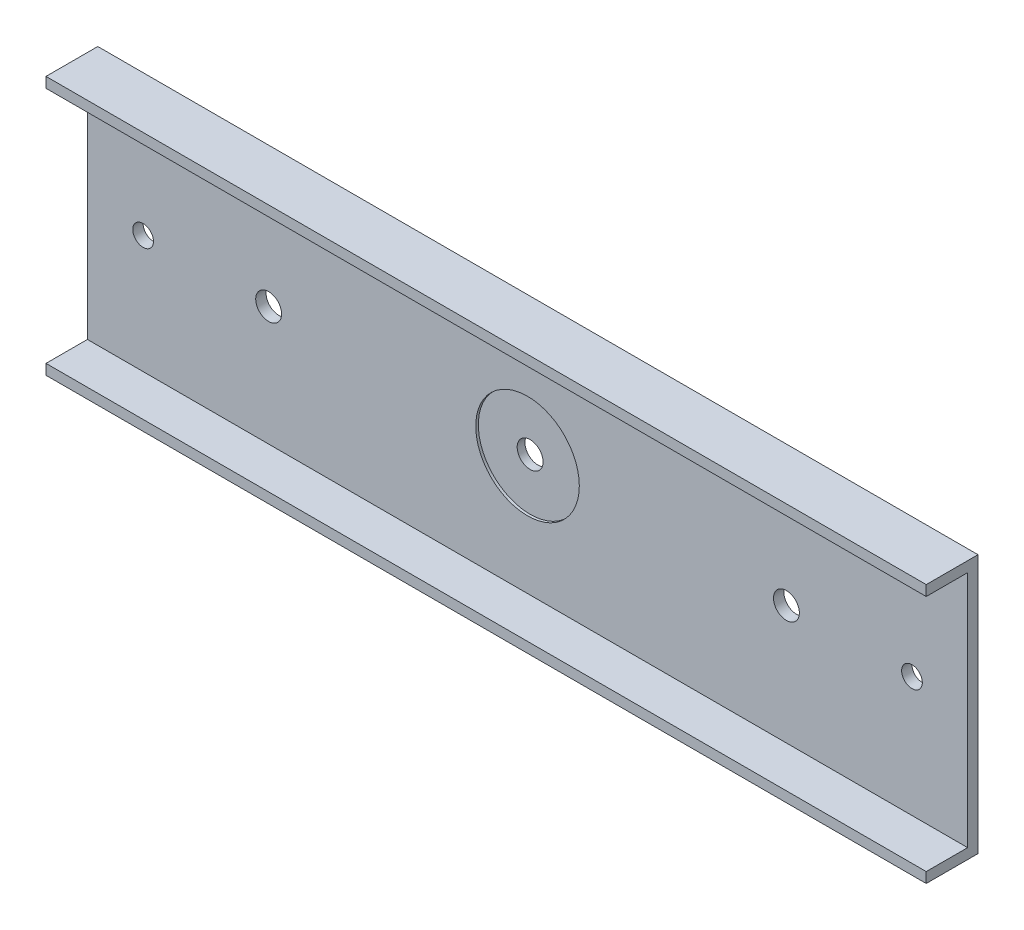
ISO-10303-21;
HEADER;
FILE_DESCRIPTION(('STEP AP214'),'2;1');
FILE_NAME('part.step','',(''),(''),'','','');
FILE_SCHEMA(('AUTOMOTIVE_DESIGN { 1 0 10303 214 1 1 1 1 }'));
ENDSEC;
DATA;
#1=APPLICATION_CONTEXT('core data for automotive mechanical design processes');
#2=APPLICATION_PROTOCOL_DEFINITION('international standard','automotive_design',2000,#1);
#3=PRODUCT_CONTEXT('',#1,'mechanical');
#4=PRODUCT('Part','Part','',(#3));
#5=PRODUCT_RELATED_PRODUCT_CATEGORY('part','',(#4));
#6=PRODUCT_DEFINITION_FORMATION('','',#4);
#7=PRODUCT_DEFINITION_CONTEXT('part definition',#1,'design');
#8=PRODUCT_DEFINITION('design','',#6,#7);
#9=PRODUCT_DEFINITION_SHAPE('','',#8);
#10=(LENGTH_UNIT() NAMED_UNIT(*) SI_UNIT(.MILLI.,.METRE.));
#11=(NAMED_UNIT(*) PLANE_ANGLE_UNIT() SI_UNIT($,.RADIAN.));
#12=(NAMED_UNIT(*) SI_UNIT($,.STERADIAN.) SOLID_ANGLE_UNIT());
#13=UNCERTAINTY_MEASURE_WITH_UNIT(LENGTH_MEASURE(1.E-05),#10,'distance_accuracy_value','');
#14=(GEOMETRIC_REPRESENTATION_CONTEXT(3) GLOBAL_UNCERTAINTY_ASSIGNED_CONTEXT((#13)) GLOBAL_UNIT_ASSIGNED_CONTEXT((#10,
#11,#12)) REPRESENTATION_CONTEXT('',''));
#15=CARTESIAN_POINT('',(0.,0.,0.));
#16=DIRECTION('',(0.,0.,1.));
#17=DIRECTION('',(1.,0.,0.));
#18=AXIS2_PLACEMENT_3D('',#15,#16,#17);
#19=CARTESIAN_POINT('',(0.,0.,2.));
#20=DIRECTION('',(0.,0.,-1.));
#21=DIRECTION('',(-1.,0.,0.));
#22=AXIS2_PLACEMENT_3D('',#19,#20,#21);
#23=CYLINDRICAL_SURFACE('',#22,2.5);
#24=CARTESIAN_POINT('',(0.,0.,0.));
#25=DIRECTION('',(0.,0.,-1.));
#26=DIRECTION('',(-1.,0.,0.));
#27=AXIS2_PLACEMENT_3D('',#24,#25,#26);
#28=CIRCLE('',#27,2.5);
#29=CARTESIAN_POINT('',(-2.5,0.,0.));
#30=VERTEX_POINT('',#29);
#31=EDGE_CURVE('E141',#30,#30,#28,.T.);
#32=ORIENTED_EDGE('',*,*,#31,.T.);
#33=EDGE_LOOP('',(#32));
#34=FACE_BOUND('',#33,.T.);
#35=CARTESIAN_POINT('',(0.,0.,1.5));
#36=DIRECTION('',(0.,0.,1.));
#37=DIRECTION('',(1.,0.,0.));
#38=AXIS2_PLACEMENT_3D('',#35,#36,#37);
#39=CIRCLE('',#38,2.5);
#40=CARTESIAN_POINT('',(2.5,0.,1.5));
#41=VERTEX_POINT('',#40);
#42=EDGE_CURVE('E49',#41,#41,#39,.F.);
#43=ORIENTED_EDGE('',*,*,#42,.F.);
#44=EDGE_LOOP('',(#43));
#45=FACE_BOUND('',#44,.T.);
#46=ADVANCED_FACE('F45',(#34,#45),#23,.F.);
#47=CARTESIAN_POINT('',(0.,0.,2.));
#48=DIRECTION('',(0.,0.,-1.));
#49=DIRECTION('',(-1.,0.,0.));
#50=AXIS2_PLACEMENT_3D('',#47,#48,#49);
#51=PLANE('',#50);
#52=CARTESIAN_POINT('',(74.245869061746,0.225670702875866,2.));
#53=DIRECTION('',(0.,0.,-1.));
#54=DIRECTION('',(-1.,0.,0.));
#55=AXIS2_PLACEMENT_3D('',#52,#53,#54);
#56=CIRCLE('',#55,2.00000000000001);
#57=CARTESIAN_POINT('',(72.245869061746,0.225670702875866,2.));
#58=VERTEX_POINT('',#57);
#59=EDGE_CURVE('E333',#58,#58,#56,.T.);
#60=ORIENTED_EDGE('',*,*,#59,.T.);
#61=EDGE_LOOP('',(#60));
#62=FACE_BOUND('',#61,.T.);
#63=CARTESIAN_POINT('',(-74.2458690617452,-0.225670702875446,2.));
#64=DIRECTION('',(0.,0.,-1.));
#65=DIRECTION('',(-1.,0.,0.));
#66=AXIS2_PLACEMENT_3D('',#63,#64,#65);
#67=CIRCLE('',#66,2.);
#68=CARTESIAN_POINT('',(-76.2458690617452,-0.225670702875446,2.));
#69=VERTEX_POINT('',#68);
#70=EDGE_CURVE('E336',#69,#69,#67,.T.);
#71=ORIENTED_EDGE('',*,*,#70,.T.);
#72=EDGE_LOOP('',(#71));
#73=FACE_BOUND('',#72,.T.);
#74=CARTESIAN_POINT('',(0.,0.,2.));
#75=DIRECTION('',(0.,0.,1.));
#76=DIRECTION('',(1.,0.,0.));
#77=AXIS2_PLACEMENT_3D('',#74,#75,#76);
#78=CIRCLE('',#77,10.);
#79=CARTESIAN_POINT('',(10.,0.,2.));
#80=VERTEX_POINT('',#79);
#81=EDGE_CURVE('E335',#80,#80,#78,.T.);
#82=ORIENTED_EDGE('',*,*,#81,.F.);
#83=EDGE_LOOP('',(#82));
#84=FACE_BOUND('',#83,.T.);
#85=CARTESIAN_POINT('',(-50.,0.,2.));
#86=DIRECTION('',(0.,0.,-1.));
#87=DIRECTION('',(-1.,0.,0.));
#88=AXIS2_PLACEMENT_3D('',#85,#86,#87);
#89=CIRCLE('',#88,2.5);
#90=CARTESIAN_POINT('',(-52.5,0.,2.));
#91=VERTEX_POINT('',#90);
#92=EDGE_CURVE('E362',#91,#91,#89,.T.);
#93=ORIENTED_EDGE('',*,*,#92,.T.);
#94=EDGE_LOOP('',(#93));
#95=FACE_BOUND('',#94,.T.);
#96=CARTESIAN_POINT('',(50.,0.,2.));
#97=DIRECTION('',(0.,0.,-1.));
#98=DIRECTION('',(-1.,0.,0.));
#99=AXIS2_PLACEMENT_3D('',#96,#97,#98);
#100=CIRCLE('',#99,2.5);
#101=CARTESIAN_POINT('',(47.5,0.,2.));
#102=VERTEX_POINT('',#101);
#103=EDGE_CURVE('E354',#102,#102,#100,.T.);
#104=ORIENTED_EDGE('',*,*,#103,.T.);
#105=EDGE_LOOP('',(#104));
#106=FACE_BOUND('',#105,.T.);
#107=DIRECTION('',(0.,-1.,0.));
#108=VECTOR('',#107,1.);
#109=CARTESIAN_POINT('',(-85.,-25.,2.));
#110=LINE('',#109,#108);
#111=CARTESIAN_POINT('',(-85.,23.,2.));
#112=VERTEX_POINT('',#111);
#113=CARTESIAN_POINT('',(-85.,-23.,2.));
#114=VERTEX_POINT('',#113);
#115=EDGE_CURVE('E67',#112,#114,#110,.T.);
#116=ORIENTED_EDGE('',*,*,#115,.T.);
#117=DIRECTION('',(1.,0.,0.));
#118=VECTOR('',#117,1.);
#119=CARTESIAN_POINT('',(0.,-23.,2.));
#120=LINE('',#119,#118);
#121=CARTESIAN_POINT('',(85.,-23.,2.));
#122=VERTEX_POINT('',#121);
#123=EDGE_CURVE('E62',#114,#122,#120,.T.);
#124=ORIENTED_EDGE('',*,*,#123,.T.);
#125=DIRECTION('',(0.,1.,0.));
#126=VECTOR('',#125,1.);
#127=CARTESIAN_POINT('',(85.,-25.,2.));
#128=LINE('',#127,#126);
#129=CARTESIAN_POINT('',(85.,23.,2.));
#130=VERTEX_POINT('',#129);
#131=EDGE_CURVE('E116',#122,#130,#128,.T.);
#132=ORIENTED_EDGE('',*,*,#131,.T.);
#133=DIRECTION('',(1.,0.,0.));
#134=VECTOR('',#133,1.);
#135=CARTESIAN_POINT('',(0.,23.,2.));
#136=LINE('',#135,#134);
#137=EDGE_CURVE('E165',#112,#130,#136,.T.);
#138=ORIENTED_EDGE('',*,*,#137,.F.);
#139=EDGE_LOOP('',(#116,#124,#132,#138));
#140=FACE_BOUND('',#139,.T.);
#141=ADVANCED_FACE('F222',(#62,#73,#84,#95,#106,#140),#51,.F.);
#142=CARTESIAN_POINT('',(85.,-25.,2.));
#143=DIRECTION('',(-1.,0.,0.));
#144=DIRECTION('',(0.,0.,1.));
#145=AXIS2_PLACEMENT_3D('',#142,#143,#144);
#146=PLANE('',#145);
#147=ORIENTED_EDGE('',*,*,#131,.F.);
#148=DIRECTION('',(0.,0.,1.));
#149=VECTOR('',#148,1.);
#150=CARTESIAN_POINT('',(85.,-23.,0.));
#151=LINE('',#150,#149);
#152=CARTESIAN_POINT('',(85.,-23.,10.));
#153=VERTEX_POINT('',#152);
#154=EDGE_CURVE('E110',#122,#153,#151,.T.);
#155=ORIENTED_EDGE('',*,*,#154,.T.);
#156=DIRECTION('',(0.,-1.,0.));
#157=VECTOR('',#156,1.);
#158=CARTESIAN_POINT('',(85.,-23.,10.));
#159=LINE('',#158,#157);
#160=CARTESIAN_POINT('',(85.,-25.,10.));
#161=VERTEX_POINT('',#160);
#162=EDGE_CURVE('E113',#153,#161,#159,.T.);
#163=ORIENTED_EDGE('',*,*,#162,.T.);
#164=DIRECTION('',(0.,0.,-1.));
#165=VECTOR('',#164,1.);
#166=CARTESIAN_POINT('',(85.,-25.,2.));
#167=LINE('',#166,#165);
#168=CARTESIAN_POINT('',(85.,-25.,0.));
#169=VERTEX_POINT('',#168);
#170=EDGE_CURVE('E178',#161,#169,#167,.T.);
#171=ORIENTED_EDGE('',*,*,#170,.T.);
#172=DIRECTION('',(0.,1.,0.));
#173=VECTOR('',#172,1.);
#174=CARTESIAN_POINT('',(85.,-25.,0.));
#175=LINE('',#174,#173);
#176=CARTESIAN_POINT('',(85.,25.,0.));
#177=VERTEX_POINT('',#176);
#178=EDGE_CURVE('E172',#169,#177,#175,.T.);
#179=ORIENTED_EDGE('',*,*,#178,.T.);
#180=DIRECTION('',(0.,0.,-1.));
#181=VECTOR('',#180,1.);
#182=CARTESIAN_POINT('',(85.,25.,2.));
#183=LINE('',#182,#181);
#184=CARTESIAN_POINT('',(85.,25.,10.));
#185=VERTEX_POINT('',#184);
#186=EDGE_CURVE('E11',#185,#177,#183,.T.);
#187=ORIENTED_EDGE('',*,*,#186,.F.);
#188=DIRECTION('',(0.,1.,0.));
#189=VECTOR('',#188,1.);
#190=CARTESIAN_POINT('',(85.,23.,10.));
#191=LINE('',#190,#189);
#192=CARTESIAN_POINT('',(85.,23.,10.));
#193=VERTEX_POINT('',#192);
#194=EDGE_CURVE('E161',#193,#185,#191,.T.);
#195=ORIENTED_EDGE('',*,*,#194,.F.);
#196=DIRECTION('',(0.,0.,-1.));
#197=VECTOR('',#196,1.);
#198=CARTESIAN_POINT('',(85.,23.,0.));
#199=LINE('',#198,#197);
#200=EDGE_CURVE('E154',#193,#130,#199,.T.);
#201=ORIENTED_EDGE('',*,*,#200,.T.);
#202=EDGE_LOOP('',(#147,#155,#163,#171,#179,#187,#195,#201));
#203=FACE_BOUND('',#202,.T.);
#204=ADVANCED_FACE('F47',(#203),#146,.F.);
#205=CARTESIAN_POINT('',(-85.,25.,2.));
#206=DIRECTION('',(0.,-1.,0.));
#207=DIRECTION('',(0.,0.,-1.));
#208=AXIS2_PLACEMENT_3D('',#205,#206,#207);
#209=PLANE('',#208);
#210=DIRECTION('',(-1.,0.,0.));
#211=VECTOR('',#210,1.);
#212=CARTESIAN_POINT('',(-85.,25.,0.));
#213=LINE('',#212,#211);
#214=CARTESIAN_POINT('',(-85.,25.,0.));
#215=VERTEX_POINT('',#214);
#216=EDGE_CURVE('E181',#177,#215,#213,.T.);
#217=ORIENTED_EDGE('',*,*,#216,.T.);
#218=DIRECTION('',(0.,0.,-1.));
#219=VECTOR('',#218,1.);
#220=CARTESIAN_POINT('',(-85.,25.,2.));
#221=LINE('',#220,#219);
#222=CARTESIAN_POINT('',(-85.,25.,10.));
#223=VERTEX_POINT('',#222);
#224=EDGE_CURVE('E55',#223,#215,#221,.T.);
#225=ORIENTED_EDGE('',*,*,#224,.F.);
#226=DIRECTION('',(1.,0.,0.));
#227=VECTOR('',#226,1.);
#228=CARTESIAN_POINT('',(-85.,25.,10.));
#229=LINE('',#228,#227);
#230=EDGE_CURVE('E146',#223,#185,#229,.T.);
#231=ORIENTED_EDGE('',*,*,#230,.T.);
#232=ORIENTED_EDGE('',*,*,#186,.T.);
#233=EDGE_LOOP('',(#217,#225,#231,#232));
#234=FACE_BOUND('',#233,.T.);
#235=ADVANCED_FACE('F214',(#234),#209,.F.);
#236=CARTESIAN_POINT('',(-85.,-25.,2.));
#237=DIRECTION('',(1.,0.,0.));
#238=DIRECTION('',(0.,0.,-1.));
#239=AXIS2_PLACEMENT_3D('',#236,#237,#238);
#240=PLANE('',#239);
#241=DIRECTION('',(0.,-1.,0.));
#242=VECTOR('',#241,1.);
#243=CARTESIAN_POINT('',(-85.,-25.,0.));
#244=LINE('',#243,#242);
#245=CARTESIAN_POINT('',(-85.,-25.,0.));
#246=VERTEX_POINT('',#245);
#247=EDGE_CURVE('E184',#215,#246,#244,.T.);
#248=ORIENTED_EDGE('',*,*,#247,.T.);
#249=DIRECTION('',(0.,0.,-1.));
#250=VECTOR('',#249,1.);
#251=CARTESIAN_POINT('',(-85.,-25.,2.));
#252=LINE('',#251,#250);
#253=CARTESIAN_POINT('',(-85.,-25.,10.));
#254=VERTEX_POINT('',#253);
#255=EDGE_CURVE('E191',#254,#246,#252,.T.);
#256=ORIENTED_EDGE('',*,*,#255,.F.);
#257=DIRECTION('',(0.,-1.,0.));
#258=VECTOR('',#257,1.);
#259=CARTESIAN_POINT('',(-85.,-23.,10.));
#260=LINE('',#259,#258);
#261=CARTESIAN_POINT('',(-85.,-23.,10.));
#262=VERTEX_POINT('',#261);
#263=EDGE_CURVE('E130',#262,#254,#260,.T.);
#264=ORIENTED_EDGE('',*,*,#263,.F.);
#265=DIRECTION('',(0.,0.,-1.));
#266=VECTOR('',#265,1.);
#267=CARTESIAN_POINT('',(-85.,-23.,0.));
#268=LINE('',#267,#266);
#269=EDGE_CURVE('E121',#262,#114,#268,.T.);
#270=ORIENTED_EDGE('',*,*,#269,.T.);
#271=ORIENTED_EDGE('',*,*,#115,.F.);
#272=DIRECTION('',(0.,0.,1.));
#273=VECTOR('',#272,1.);
#274=CARTESIAN_POINT('',(-85.,23.,0.));
#275=LINE('',#274,#273);
#276=CARTESIAN_POINT('',(-85.,23.,10.));
#277=VERTEX_POINT('',#276);
#278=EDGE_CURVE('E147',#112,#277,#275,.T.);
#279=ORIENTED_EDGE('',*,*,#278,.T.);
#280=DIRECTION('',(0.,1.,0.));
#281=VECTOR('',#280,1.);
#282=CARTESIAN_POINT('',(-85.,23.,10.));
#283=LINE('',#282,#281);
#284=EDGE_CURVE('E157',#277,#223,#283,.T.);
#285=ORIENTED_EDGE('',*,*,#284,.T.);
#286=ORIENTED_EDGE('',*,*,#224,.T.);
#287=EDGE_LOOP('',(#248,#256,#264,#270,#271,#279,#285,#286));
#288=FACE_BOUND('',#287,.T.);
#289=ADVANCED_FACE('F199',(#288),#240,.F.);
#290=CARTESIAN_POINT('',(-85.,-25.,2.));
#291=DIRECTION('',(0.,1.,0.));
#292=DIRECTION('',(0.,0.,1.));
#293=AXIS2_PLACEMENT_3D('',#290,#291,#292);
#294=PLANE('',#293);
#295=DIRECTION('',(1.,0.,0.));
#296=VECTOR('',#295,1.);
#297=CARTESIAN_POINT('',(-85.,-25.,0.));
#298=LINE('',#297,#296);
#299=EDGE_CURVE('E175',#246,#169,#298,.T.);
#300=ORIENTED_EDGE('',*,*,#299,.T.);
#301=ORIENTED_EDGE('',*,*,#170,.F.);
#302=DIRECTION('',(-1.,0.,0.));
#303=VECTOR('',#302,1.);
#304=CARTESIAN_POINT('',(-85.,-25.,10.));
#305=LINE('',#304,#303);
#306=EDGE_CURVE('E128',#161,#254,#305,.T.);
#307=ORIENTED_EDGE('',*,*,#306,.T.);
#308=ORIENTED_EDGE('',*,*,#255,.T.);
#309=EDGE_LOOP('',(#300,#301,#307,#308));
#310=FACE_BOUND('',#309,.T.);
#311=ADVANCED_FACE('F209',(#310),#294,.F.);
#312=CARTESIAN_POINT('',(0.,0.,0.));
#313=DIRECTION('',(0.,0.,-1.));
#314=DIRECTION('',(-1.,0.,0.));
#315=AXIS2_PLACEMENT_3D('',#312,#313,#314);
#316=PLANE('',#315);
#317=CARTESIAN_POINT('',(74.245869061746,0.225670702875866,0.));
#318=DIRECTION('',(0.,0.,-1.));
#319=DIRECTION('',(-1.,0.,0.));
#320=AXIS2_PLACEMENT_3D('',#317,#318,#319);
#321=CIRCLE('',#320,2.00000000000001);
#322=CARTESIAN_POINT('',(72.245869061746,0.225670702875866,0.));
#323=VERTEX_POINT('',#322);
#324=EDGE_CURVE('E330',#323,#323,#321,.T.);
#325=ORIENTED_EDGE('',*,*,#324,.F.);
#326=EDGE_LOOP('',(#325));
#327=FACE_BOUND('',#326,.T.);
#328=CARTESIAN_POINT('',(-74.2458690617452,-0.225670702875446,0.));
#329=DIRECTION('',(0.,0.,-1.));
#330=DIRECTION('',(-1.,0.,0.));
#331=AXIS2_PLACEMENT_3D('',#328,#329,#330);
#332=CIRCLE('',#331,2.);
#333=CARTESIAN_POINT('',(-76.2458690617452,-0.225670702875446,0.));
#334=VERTEX_POINT('',#333);
#335=EDGE_CURVE('E389',#334,#334,#332,.T.);
#336=ORIENTED_EDGE('',*,*,#335,.F.);
#337=EDGE_LOOP('',(#336));
#338=FACE_BOUND('',#337,.T.);
#339=CARTESIAN_POINT('',(-50.,0.,0.));
#340=DIRECTION('',(0.,0.,-1.));
#341=DIRECTION('',(-1.,0.,0.));
#342=AXIS2_PLACEMENT_3D('',#339,#340,#341);
#343=CIRCLE('',#342,2.5);
#344=CARTESIAN_POINT('',(-52.5,0.,0.));
#345=VERTEX_POINT('',#344);
#346=EDGE_CURVE('E358',#345,#345,#343,.T.);
#347=ORIENTED_EDGE('',*,*,#346,.F.);
#348=EDGE_LOOP('',(#347));
#349=FACE_BOUND('',#348,.T.);
#350=CARTESIAN_POINT('',(50.,0.,0.));
#351=DIRECTION('',(0.,0.,-1.));
#352=DIRECTION('',(-1.,0.,0.));
#353=AXIS2_PLACEMENT_3D('',#350,#351,#352);
#354=CIRCLE('',#353,2.5);
#355=CARTESIAN_POINT('',(47.5,0.,0.));
#356=VERTEX_POINT('',#355);
#357=EDGE_CURVE('E350',#356,#356,#354,.T.);
#358=ORIENTED_EDGE('',*,*,#357,.F.);
#359=EDGE_LOOP('',(#358));
#360=FACE_BOUND('',#359,.T.);
#361=ORIENTED_EDGE('',*,*,#31,.F.);
#362=EDGE_LOOP('',(#361));
#363=FACE_BOUND('',#362,.T.);
#364=ORIENTED_EDGE('',*,*,#216,.F.);
#365=ORIENTED_EDGE('',*,*,#178,.F.);
#366=ORIENTED_EDGE('',*,*,#299,.F.);
#367=ORIENTED_EDGE('',*,*,#247,.F.);
#368=EDGE_LOOP('',(#364,#365,#366,#367));
#369=FACE_BOUND('',#368,.T.);
#370=ADVANCED_FACE('F206',(#327,#338,#349,#360,#363,#369),#316,.T.);
#371=CARTESIAN_POINT('',(0.,23.,0.));
#372=DIRECTION('',(0.,1.,0.));
#373=DIRECTION('',(0.,0.,1.));
#374=AXIS2_PLACEMENT_3D('',#371,#372,#373);
#375=PLANE('',#374);
#376=ORIENTED_EDGE('',*,*,#278,.F.);
#377=ORIENTED_EDGE('',*,*,#137,.T.);
#378=ORIENTED_EDGE('',*,*,#200,.F.);
#379=DIRECTION('',(1.,0.,0.));
#380=VECTOR('',#379,1.);
#381=CARTESIAN_POINT('',(-85.,23.,10.));
#382=LINE('',#381,#380);
#383=EDGE_CURVE('E150',#277,#193,#382,.T.);
#384=ORIENTED_EDGE('',*,*,#383,.F.);
#385=EDGE_LOOP('',(#376,#377,#378,#384));
#386=FACE_BOUND('',#385,.T.);
#387=ADVANCED_FACE('F244',(#386),#375,.F.);
#388=CARTESIAN_POINT('',(-85.,23.,10.));
#389=DIRECTION('',(0.,0.,1.));
#390=DIRECTION('',(1.,0.,0.));
#391=AXIS2_PLACEMENT_3D('',#388,#389,#390);
#392=PLANE('',#391);
#393=ORIENTED_EDGE('',*,*,#230,.F.);
#394=ORIENTED_EDGE('',*,*,#284,.F.);
#395=ORIENTED_EDGE('',*,*,#383,.T.);
#396=ORIENTED_EDGE('',*,*,#194,.T.);
#397=EDGE_LOOP('',(#393,#394,#395,#396));
#398=FACE_BOUND('',#397,.T.);
#399=ADVANCED_FACE('F212',(#398),#392,.T.);
#400=CARTESIAN_POINT('',(0.,-23.,0.));
#401=DIRECTION('',(0.,1.,0.));
#402=DIRECTION('',(0.,0.,1.));
#403=AXIS2_PLACEMENT_3D('',#400,#401,#402);
#404=PLANE('',#403);
#405=ORIENTED_EDGE('',*,*,#123,.F.);
#406=ORIENTED_EDGE('',*,*,#269,.F.);
#407=DIRECTION('',(-1.,0.,0.));
#408=VECTOR('',#407,1.);
#409=CARTESIAN_POINT('',(-85.,-23.,10.));
#410=LINE('',#409,#408);
#411=EDGE_CURVE('E120',#153,#262,#410,.T.);
#412=ORIENTED_EDGE('',*,*,#411,.F.);
#413=ORIENTED_EDGE('',*,*,#154,.F.);
#414=EDGE_LOOP('',(#405,#406,#412,#413));
#415=FACE_BOUND('',#414,.T.);
#416=ADVANCED_FACE('F133',(#415),#404,.T.);
#417=CARTESIAN_POINT('',(-85.,-23.,10.));
#418=DIRECTION('',(0.,0.,1.));
#419=DIRECTION('',(1.,0.,0.));
#420=AXIS2_PLACEMENT_3D('',#417,#418,#419);
#421=PLANE('',#420);
#422=ORIENTED_EDGE('',*,*,#306,.F.);
#423=ORIENTED_EDGE('',*,*,#162,.F.);
#424=ORIENTED_EDGE('',*,*,#411,.T.);
#425=ORIENTED_EDGE('',*,*,#263,.T.);
#426=EDGE_LOOP('',(#422,#423,#424,#425));
#427=FACE_BOUND('',#426,.T.);
#428=ADVANCED_FACE('F125',(#427),#421,.T.);
#429=CARTESIAN_POINT('',(50.,0.,2.));
#430=DIRECTION('',(0.,0.,-1.));
#431=DIRECTION('',(-1.,0.,0.));
#432=AXIS2_PLACEMENT_3D('',#429,#430,#431);
#433=CYLINDRICAL_SURFACE('',#432,2.5);
#434=ORIENTED_EDGE('',*,*,#103,.F.);
#435=EDGE_LOOP('',(#434));
#436=FACE_BOUND('',#435,.T.);
#437=ORIENTED_EDGE('',*,*,#357,.T.);
#438=EDGE_LOOP('',(#437));
#439=FACE_BOUND('',#438,.T.);
#440=ADVANCED_FACE('F243',(#436,#439),#433,.F.);
#441=CARTESIAN_POINT('',(-50.,0.,2.));
#442=DIRECTION('',(0.,0.,-1.));
#443=DIRECTION('',(-1.,0.,0.));
#444=AXIS2_PLACEMENT_3D('',#441,#442,#443);
#445=CYLINDRICAL_SURFACE('',#444,2.5);
#446=ORIENTED_EDGE('',*,*,#92,.F.);
#447=EDGE_LOOP('',(#446));
#448=FACE_BOUND('',#447,.T.);
#449=ORIENTED_EDGE('',*,*,#346,.T.);
#450=EDGE_LOOP('',(#449));
#451=FACE_BOUND('',#450,.T.);
#452=ADVANCED_FACE('F237',(#448,#451),#445,.F.);
#453=CARTESIAN_POINT('',(0.,0.,1.5));
#454=DIRECTION('',(0.,0.,1.));
#455=DIRECTION('',(1.,0.,0.));
#456=AXIS2_PLACEMENT_3D('',#453,#454,#455);
#457=PLANE('',#456);
#458=CARTESIAN_POINT('',(0.,0.,1.5));
#459=DIRECTION('',(0.,0.,1.));
#460=DIRECTION('',(1.,0.,0.));
#461=AXIS2_PLACEMENT_3D('',#458,#459,#460);
#462=CIRCLE('',#461,10.);
#463=CARTESIAN_POINT('',(10.,0.,1.5));
#464=VERTEX_POINT('',#463);
#465=EDGE_CURVE('E341',#464,#464,#462,.T.);
#466=ORIENTED_EDGE('',*,*,#465,.T.);
#467=EDGE_LOOP('',(#466));
#468=FACE_BOUND('',#467,.T.);
#469=ORIENTED_EDGE('',*,*,#42,.T.);
#470=EDGE_LOOP('',(#469));
#471=FACE_BOUND('',#470,.T.);
#472=ADVANCED_FACE('F279',(#468,#471),#457,.T.);
#473=CARTESIAN_POINT('',(0.,0.,1.5));
#474=DIRECTION('',(0.,0.,1.));
#475=DIRECTION('',(1.,0.,0.));
#476=AXIS2_PLACEMENT_3D('',#473,#474,#475);
#477=CYLINDRICAL_SURFACE('',#476,10.);
#478=ORIENTED_EDGE('',*,*,#465,.F.);
#479=EDGE_LOOP('',(#478));
#480=FACE_BOUND('',#479,.T.);
#481=ORIENTED_EDGE('',*,*,#81,.T.);
#482=EDGE_LOOP('',(#481));
#483=FACE_BOUND('',#482,.T.);
#484=ADVANCED_FACE('F294',(#480,#483),#477,.F.);
#485=CARTESIAN_POINT('',(-74.2458690617452,-0.225670702875446,30.));
#486=DIRECTION('',(0.,0.,-1.));
#487=DIRECTION('',(-1.,0.,0.));
#488=AXIS2_PLACEMENT_3D('',#485,#486,#487);
#489=CYLINDRICAL_SURFACE('',#488,2.);
#490=ORIENTED_EDGE('',*,*,#335,.T.);
#491=EDGE_LOOP('',(#490));
#492=FACE_BOUND('',#491,.T.);
#493=ORIENTED_EDGE('',*,*,#70,.F.);
#494=EDGE_LOOP('',(#493));
#495=FACE_BOUND('',#494,.T.);
#496=ADVANCED_FACE('F304',(#492,#495),#489,.F.);
#497=CARTESIAN_POINT('',(74.245869061746,0.225670702875866,30.));
#498=DIRECTION('',(0.,0.,-1.));
#499=DIRECTION('',(-1.,0.,0.));
#500=AXIS2_PLACEMENT_3D('',#497,#498,#499);
#501=CYLINDRICAL_SURFACE('',#500,2.00000000000001);
#502=ORIENTED_EDGE('',*,*,#324,.T.);
#503=EDGE_LOOP('',(#502));
#504=FACE_BOUND('',#503,.T.);
#505=ORIENTED_EDGE('',*,*,#59,.F.);
#506=EDGE_LOOP('',(#505));
#507=FACE_BOUND('',#506,.T.);
#508=ADVANCED_FACE('F314',(#504,#507),#501,.F.);
#509=CLOSED_SHELL('',(#46,#141,#204,#235,#289,#311,#370,#387,#399,#416,#428,#440,#452,#472,#484,
#496,#508));
#510=MANIFOLD_SOLID_BREP('B2',#509);
#511=ADVANCED_BREP_SHAPE_REPRESENTATION('',(#18,#510),#14);
#512=SHAPE_DEFINITION_REPRESENTATION(#9,#511);
ENDSEC;
END-ISO-10303-21;
